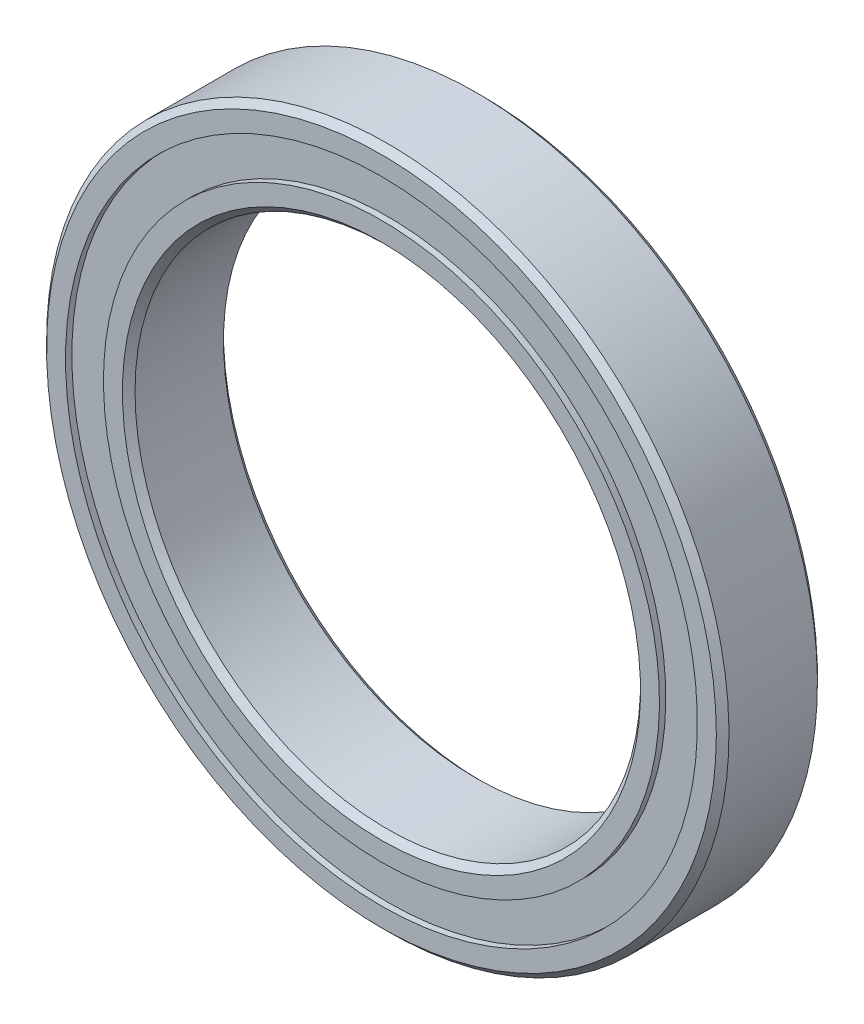
ISO-10303-21;
HEADER;
FILE_DESCRIPTION(('STEP AP214'),'2;1');
FILE_NAME('part.step','',(''),(''),'','','');
FILE_SCHEMA(('AUTOMOTIVE_DESIGN { 1 0 10303 214 1 1 1 1 }'));
ENDSEC;
DATA;
#1=APPLICATION_CONTEXT('core data for automotive mechanical design processes');
#2=APPLICATION_PROTOCOL_DEFINITION('international standard','automotive_design',2000,#1);
#3=PRODUCT_CONTEXT('',#1,'mechanical');
#4=PRODUCT('Part','Part','',(#3));
#5=PRODUCT_RELATED_PRODUCT_CATEGORY('part','',(#4));
#6=PRODUCT_DEFINITION_FORMATION('','',#4);
#7=PRODUCT_DEFINITION_CONTEXT('part definition',#1,'design');
#8=PRODUCT_DEFINITION('design','',#6,#7);
#9=PRODUCT_DEFINITION_SHAPE('','',#8);
#10=(LENGTH_UNIT() NAMED_UNIT(*) SI_UNIT(.MILLI.,.METRE.));
#11=(NAMED_UNIT(*) PLANE_ANGLE_UNIT() SI_UNIT($,.RADIAN.));
#12=(NAMED_UNIT(*) SI_UNIT($,.STERADIAN.) SOLID_ANGLE_UNIT());
#13=UNCERTAINTY_MEASURE_WITH_UNIT(LENGTH_MEASURE(1.E-05),#10,'distance_accuracy_value','');
#14=(GEOMETRIC_REPRESENTATION_CONTEXT(3) GLOBAL_UNCERTAINTY_ASSIGNED_CONTEXT((#13)) GLOBAL_UNIT_ASSIGNED_CONTEXT((#10,
#11,#12)) REPRESENTATION_CONTEXT('',''));
#15=CARTESIAN_POINT('',(0.,0.,0.));
#16=DIRECTION('',(0.,0.,1.));
#17=DIRECTION('',(1.,0.,0.));
#18=AXIS2_PLACEMENT_3D('',#15,#16,#17);
#19=CARTESIAN_POINT('',(0.,0.,5.));
#20=DIRECTION('',(0.,0.,-1.));
#21=DIRECTION('',(-0.117109143745426,0.993119050492545,0.));
#22=AXIS2_PLACEMENT_3D('',#19,#20,#21);
#23=CYLINDRICAL_SURFACE('',#22,13.5);
#24=CARTESIAN_POINT('',(0.,0.,4.75));
#25=DIRECTION('',(0.,0.,-1.));
#26=DIRECTION('',(-0.117109143745426,0.993119050492545,0.));
#27=AXIS2_PLACEMENT_3D('',#24,#25,#26);
#28=CIRCLE('',#27,13.5);
#29=CARTESIAN_POINT('',(-1.58097344056327,13.4071071816495,4.75));
#30=VERTEX_POINT('',#29);
#31=EDGE_CURVE('E27',#30,#30,#28,.T.);
#32=ORIENTED_EDGE('',*,*,#31,.T.);
#33=EDGE_LOOP('',(#32));
#34=FACE_BOUND('',#33,.T.);
#35=CARTESIAN_POINT('',(0.,0.,1.25));
#36=DIRECTION('',(0.,0.,1.));
#37=DIRECTION('',(-0.117109143745426,0.993119050492545,0.));
#38=AXIS2_PLACEMENT_3D('',#35,#36,#37);
#39=CIRCLE('',#38,13.5);
#40=CARTESIAN_POINT('',(-1.58097344056327,13.4071071816495,1.25));
#41=VERTEX_POINT('',#40);
#42=EDGE_CURVE('E11',#41,#41,#39,.T.);
#43=ORIENTED_EDGE('',*,*,#42,.T.);
#44=EDGE_LOOP('',(#43));
#45=FACE_BOUND('',#44,.T.);
#46=ADVANCED_FACE('F17',(#34,#45),#23,.T.);
#47=CARTESIAN_POINT('',(0.,0.,1.24999999999993));
#48=DIRECTION('',(0.,0.,1.));
#49=DIRECTION('',(0.117109143745426,-0.993119050492545,0.));
#50=AXIS2_PLACEMENT_3D('',#47,#48,#49);
#51=CONICAL_SURFACE('',#50,13.5,0.78539816339745);
#52=CARTESIAN_POINT('',(0.,0.,0.999999999999963));
#53=DIRECTION('',(0.,0.,1.));
#54=DIRECTION('',(0.117109143745426,-0.993119050492545,0.));
#55=AXIS2_PLACEMENT_3D('',#52,#53,#54);
#56=CIRCLE('',#55,13.25);
#57=CARTESIAN_POINT('',(1.5516961546269,-13.1588274190262,0.999999999999963));
#58=VERTEX_POINT('',#57);
#59=EDGE_CURVE('E127',#58,#58,#56,.T.);
#60=ORIENTED_EDGE('',*,*,#59,.T.);
#61=EDGE_LOOP('',(#60));
#62=FACE_BOUND('',#61,.T.);
#63=ORIENTED_EDGE('',*,*,#42,.F.);
#64=EDGE_LOOP('',(#63));
#65=FACE_BOUND('',#64,.T.);
#66=ADVANCED_FACE('F193',(#62,#65),#51,.T.);
#67=CARTESIAN_POINT('',(0.,0.,4.75000000000007));
#68=DIRECTION('',(0.,0.,-1.));
#69=DIRECTION('',(-0.117109143745426,0.993119050492545,0.));
#70=AXIS2_PLACEMENT_3D('',#67,#68,#69);
#71=CONICAL_SURFACE('',#70,13.5,0.785398163397435);
#72=CARTESIAN_POINT('',(0.,0.,5.00000000000007));
#73=DIRECTION('',(0.,0.,-1.));
#74=DIRECTION('',(-0.117109143745426,0.993119050492545,0.));
#75=AXIS2_PLACEMENT_3D('',#72,#73,#74);
#76=CIRCLE('',#75,13.25);
#77=CARTESIAN_POINT('',(-1.5516961546269,13.1588274190262,5.00000000000007));
#78=VERTEX_POINT('',#77);
#79=EDGE_CURVE('E128',#78,#78,#76,.T.);
#80=ORIENTED_EDGE('',*,*,#79,.T.);
#81=EDGE_LOOP('',(#80));
#82=FACE_BOUND('',#81,.T.);
#83=ORIENTED_EDGE('',*,*,#31,.F.);
#84=EDGE_LOOP('',(#83));
#85=FACE_BOUND('',#84,.T.);
#86=ADVANCED_FACE('F198',(#82,#85),#71,.T.);
#87=CARTESIAN_POINT('',(0.,0.,1.25));
#88=DIRECTION('',(0.,0.,-1.));
#89=DIRECTION('',(-0.117109143745426,0.993119050492545,0.));
#90=AXIS2_PLACEMENT_3D('',#87,#88,#89);
#91=CYLINDRICAL_SURFACE('',#90,12.5);
#92=CARTESIAN_POINT('',(0.,0.,1.25));
#93=DIRECTION('',(0.,0.,-1.));
#94=DIRECTION('',(-0.117109143745426,0.993119050492545,0.));
#95=AXIS2_PLACEMENT_3D('',#92,#93,#94);
#96=CIRCLE('',#95,12.5);
#97=CARTESIAN_POINT('',(-1.46386429681784,12.4139881311569,1.25));
#98=VERTEX_POINT('',#97);
#99=EDGE_CURVE('E123',#98,#98,#96,.T.);
#100=ORIENTED_EDGE('',*,*,#99,.F.);
#101=EDGE_LOOP('',(#100));
#102=FACE_BOUND('',#101,.T.);
#103=CARTESIAN_POINT('',(0.,0.,1.));
#104=DIRECTION('',(0.,0.,-1.));
#105=DIRECTION('',(-0.117109143745426,0.993119050492545,0.));
#106=AXIS2_PLACEMENT_3D('',#103,#104,#105);
#107=CIRCLE('',#106,12.5);
#108=CARTESIAN_POINT('',(-1.46386429681784,12.4139881311569,1.));
#109=VERTEX_POINT('',#108);
#110=EDGE_CURVE('E133',#109,#109,#107,.T.);
#111=ORIENTED_EDGE('',*,*,#110,.T.);
#112=EDGE_LOOP('',(#111));
#113=FACE_BOUND('',#112,.T.);
#114=ADVANCED_FACE('F19',(#102,#113),#91,.F.);
#115=CARTESIAN_POINT('',(0.,0.,1.25));
#116=DIRECTION('',(0.,0.,-1.));
#117=DIRECTION('',(-0.117109143745426,0.993119050492545,0.));
#118=AXIS2_PLACEMENT_3D('',#115,#116,#117);
#119=CYLINDRICAL_SURFACE('',#118,12.5);
#120=CARTESIAN_POINT('',(0.,0.,4.75));
#121=DIRECTION('',(0.,0.,1.));
#122=DIRECTION('',(0.,-1.,0.));
#123=AXIS2_PLACEMENT_3D('',#120,#121,#122);
#124=CIRCLE('',#123,12.5);
#125=CARTESIAN_POINT('',(0.,-12.5,4.75));
#126=VERTEX_POINT('',#125);
#127=EDGE_CURVE('E112',#126,#126,#124,.T.);
#128=ORIENTED_EDGE('',*,*,#127,.F.);
#129=EDGE_LOOP('',(#128));
#130=FACE_BOUND('',#129,.T.);
#131=CARTESIAN_POINT('',(0.,0.,5.));
#132=DIRECTION('',(0.,0.,-1.));
#133=DIRECTION('',(0.,-1.,0.));
#134=AXIS2_PLACEMENT_3D('',#131,#132,#133);
#135=CIRCLE('',#134,12.5);
#136=CARTESIAN_POINT('',(0.,-12.5,5.));
#137=VERTEX_POINT('',#136);
#138=EDGE_CURVE('E124',#137,#137,#135,.T.);
#139=ORIENTED_EDGE('',*,*,#138,.F.);
#140=EDGE_LOOP('',(#139));
#141=FACE_BOUND('',#140,.T.);
#142=ADVANCED_FACE('F179',(#130,#141),#119,.F.);
#143=CARTESIAN_POINT('',(0.,0.,1.25));
#144=DIRECTION('',(0.,0.,-1.));
#145=DIRECTION('',(-0.117109143745426,0.993119050492545,0.));
#146=AXIS2_PLACEMENT_3D('',#143,#144,#145);
#147=CYLINDRICAL_SURFACE('',#146,11.);
#148=CARTESIAN_POINT('',(0.,0.,1.25));
#149=DIRECTION('',(0.,0.,1.));
#150=DIRECTION('',(-0.117109143745426,0.993119050492545,0.));
#151=AXIS2_PLACEMENT_3D('',#148,#149,#150);
#152=CIRCLE('',#151,11.);
#153=CARTESIAN_POINT('',(-1.28820058119969,10.924309555418,1.25));
#154=VERTEX_POINT('',#153);
#155=EDGE_CURVE('E118',#154,#154,#152,.T.);
#156=ORIENTED_EDGE('',*,*,#155,.F.);
#157=EDGE_LOOP('',(#156));
#158=FACE_BOUND('',#157,.T.);
#159=CARTESIAN_POINT('',(0.,0.,1.));
#160=DIRECTION('',(0.,0.,1.));
#161=DIRECTION('',(-0.117109143745426,0.993119050492545,0.));
#162=AXIS2_PLACEMENT_3D('',#159,#160,#161);
#163=CIRCLE('',#162,11.);
#164=CARTESIAN_POINT('',(-1.28820058119969,10.924309555418,1.));
#165=VERTEX_POINT('',#164);
#166=EDGE_CURVE('E100',#165,#165,#163,.T.);
#167=ORIENTED_EDGE('',*,*,#166,.T.);
#168=EDGE_LOOP('',(#167));
#169=FACE_BOUND('',#168,.T.);
#170=ADVANCED_FACE('F101',(#158,#169),#147,.T.);
#171=CARTESIAN_POINT('',(0.,0.,1.25));
#172=DIRECTION('',(0.,0.,-1.));
#173=DIRECTION('',(-0.117109143745426,0.993119050492545,0.));
#174=AXIS2_PLACEMENT_3D('',#171,#172,#173);
#175=CYLINDRICAL_SURFACE('',#174,11.);
#176=CARTESIAN_POINT('',(0.,0.,4.75));
#177=DIRECTION('',(0.,0.,-1.));
#178=DIRECTION('',(0.,-1.,0.));
#179=AXIS2_PLACEMENT_3D('',#176,#177,#178);
#180=CIRCLE('',#179,11.);
#181=CARTESIAN_POINT('',(0.,-11.,4.75));
#182=VERTEX_POINT('',#181);
#183=EDGE_CURVE('E104',#182,#182,#180,.T.);
#184=ORIENTED_EDGE('',*,*,#183,.F.);
#185=EDGE_LOOP('',(#184));
#186=FACE_BOUND('',#185,.T.);
#187=CARTESIAN_POINT('',(0.,0.,5.));
#188=DIRECTION('',(0.,0.,-1.));
#189=DIRECTION('',(0.,-1.,0.));
#190=AXIS2_PLACEMENT_3D('',#187,#188,#189);
#191=CIRCLE('',#190,11.);
#192=CARTESIAN_POINT('',(0.,-11.,5.));
#193=VERTEX_POINT('',#192);
#194=EDGE_CURVE('E114',#193,#193,#191,.T.);
#195=ORIENTED_EDGE('',*,*,#194,.T.);
#196=EDGE_LOOP('',(#195));
#197=FACE_BOUND('',#196,.T.);
#198=ADVANCED_FACE('F178',(#186,#197),#175,.T.);
#199=CARTESIAN_POINT('',(0.,0.,1.));
#200=DIRECTION('',(0.,0.,-1.));
#201=DIRECTION('',(-0.993119050492545,-0.117109143745426,0.));
#202=AXIS2_PLACEMENT_3D('',#199,#200,#201);
#203=CONICAL_SURFACE('',#202,10.25,0.785398163397442);
#204=CARTESIAN_POINT('',(0.,0.,1.25000000000005));
#205=DIRECTION('',(0.,0.,-1.));
#206=DIRECTION('',(-0.993119050492545,-0.117109143745426,0.));
#207=AXIS2_PLACEMENT_3D('',#204,#205,#206);
#208=CIRCLE('',#207,10.);
#209=CARTESIAN_POINT('',(-9.93119050492544,-1.17109143745426,1.25000000000005));
#210=VERTEX_POINT('',#209);
#211=EDGE_CURVE('E136',#210,#210,#208,.T.);
#212=ORIENTED_EDGE('',*,*,#211,.F.);
#213=EDGE_LOOP('',(#212));
#214=FACE_BOUND('',#213,.T.);
#215=CARTESIAN_POINT('',(0.,0.,1.));
#216=DIRECTION('',(0.,0.,-1.));
#217=DIRECTION('',(-0.993119050492545,-0.117109143745426,0.));
#218=AXIS2_PLACEMENT_3D('',#215,#216,#217);
#219=CIRCLE('',#218,10.25);
#220=CARTESIAN_POINT('',(-10.1794702675486,-1.20036872339062,1.));
#221=VERTEX_POINT('',#220);
#222=EDGE_CURVE('E105',#221,#221,#219,.T.);
#223=ORIENTED_EDGE('',*,*,#222,.T.);
#224=EDGE_LOOP('',(#223));
#225=FACE_BOUND('',#224,.T.);
#226=ADVANCED_FACE('F152',(#214,#225),#203,.F.);
#227=CARTESIAN_POINT('',(0.,0.,5.));
#228=DIRECTION('',(0.,0.,1.));
#229=DIRECTION('',(0.993119050492545,0.117109143745426,0.));
#230=AXIS2_PLACEMENT_3D('',#227,#228,#229);
#231=CONICAL_SURFACE('',#230,10.25,0.785398163397456);
#232=CARTESIAN_POINT('',(0.,0.,4.75));
#233=DIRECTION('',(0.,0.,1.));
#234=DIRECTION('',(0.993119050492545,0.117109143745426,0.));
#235=AXIS2_PLACEMENT_3D('',#232,#233,#234);
#236=CIRCLE('',#235,10.);
#237=CARTESIAN_POINT('',(9.93119050492544,1.17109143745426,4.75));
#238=VERTEX_POINT('',#237);
#239=EDGE_CURVE('E21',#238,#238,#236,.T.);
#240=ORIENTED_EDGE('',*,*,#239,.F.);
#241=EDGE_LOOP('',(#240));
#242=FACE_BOUND('',#241,.T.);
#243=CARTESIAN_POINT('',(0.,0.,5.));
#244=DIRECTION('',(0.,0.,-1.));
#245=DIRECTION('',(0.993119050492545,0.117109143745426,0.));
#246=AXIS2_PLACEMENT_3D('',#243,#244,#245);
#247=CIRCLE('',#246,10.25);
#248=CARTESIAN_POINT('',(10.1794702675486,1.20036872339062,5.));
#249=VERTEX_POINT('',#248);
#250=EDGE_CURVE('E155',#249,#249,#247,.T.);
#251=ORIENTED_EDGE('',*,*,#250,.F.);
#252=EDGE_LOOP('',(#251));
#253=FACE_BOUND('',#252,.T.);
#254=ADVANCED_FACE('F149',(#242,#253),#231,.F.);
#255=CARTESIAN_POINT('',(0.,0.,5.));
#256=DIRECTION('',(0.,0.,-1.));
#257=DIRECTION('',(-0.117109143745426,0.993119050492545,0.));
#258=AXIS2_PLACEMENT_3D('',#255,#256,#257);
#259=CYLINDRICAL_SURFACE('',#258,10.);
#260=ORIENTED_EDGE('',*,*,#239,.T.);
#261=EDGE_LOOP('',(#260));
#262=FACE_BOUND('',#261,.T.);
#263=ORIENTED_EDGE('',*,*,#211,.T.);
#264=EDGE_LOOP('',(#263));
#265=FACE_BOUND('',#264,.T.);
#266=ADVANCED_FACE('F147',(#262,#265),#259,.F.);
#267=CARTESIAN_POINT('',(0.,0.,1.));
#268=DIRECTION('',(0.,0.,1.));
#269=DIRECTION('',(0.,-1.,0.));
#270=AXIS2_PLACEMENT_3D('',#267,#268,#269);
#271=PLANE('',#270);
#272=ORIENTED_EDGE('',*,*,#110,.F.);
#273=EDGE_LOOP('',(#272));
#274=FACE_BOUND('',#273,.T.);
#275=ORIENTED_EDGE('',*,*,#59,.F.);
#276=EDGE_LOOP('',(#275));
#277=FACE_BOUND('',#276,.T.);
#278=ADVANCED_FACE('F204',(#274,#277),#271,.F.);
#279=CARTESIAN_POINT('',(0.,0.,5.));
#280=DIRECTION('',(0.,0.,1.));
#281=DIRECTION('',(0.,-1.,0.));
#282=AXIS2_PLACEMENT_3D('',#279,#280,#281);
#283=PLANE('',#282);
#284=ORIENTED_EDGE('',*,*,#138,.T.);
#285=EDGE_LOOP('',(#284));
#286=FACE_BOUND('',#285,.T.);
#287=ORIENTED_EDGE('',*,*,#79,.F.);
#288=EDGE_LOOP('',(#287));
#289=FACE_BOUND('',#288,.T.);
#290=ADVANCED_FACE('F205',(#286,#289),#283,.T.);
#291=CARTESIAN_POINT('',(0.,0.,1.25));
#292=DIRECTION('',(0.,0.,-1.));
#293=DIRECTION('',(-1.,0.,0.));
#294=AXIS2_PLACEMENT_3D('',#291,#292,#293);
#295=PLANE('',#294);
#296=ORIENTED_EDGE('',*,*,#155,.T.);
#297=EDGE_LOOP('',(#296));
#298=FACE_BOUND('',#297,.T.);
#299=ORIENTED_EDGE('',*,*,#99,.T.);
#300=EDGE_LOOP('',(#299));
#301=FACE_BOUND('',#300,.T.);
#302=ADVANCED_FACE('F174',(#298,#301),#295,.T.);
#303=CARTESIAN_POINT('',(0.,0.,4.75));
#304=DIRECTION('',(0.,0.,1.));
#305=DIRECTION('',(0.,-1.,0.));
#306=AXIS2_PLACEMENT_3D('',#303,#304,#305);
#307=PLANE('',#306);
#308=ORIENTED_EDGE('',*,*,#127,.T.);
#309=EDGE_LOOP('',(#308));
#310=FACE_BOUND('',#309,.T.);
#311=ORIENTED_EDGE('',*,*,#183,.T.);
#312=EDGE_LOOP('',(#311));
#313=FACE_BOUND('',#312,.T.);
#314=ADVANCED_FACE('F211',(#310,#313),#307,.T.);
#315=CARTESIAN_POINT('',(0.,0.,1.));
#316=DIRECTION('',(0.,0.,1.));
#317=DIRECTION('',(0.,-1.,0.));
#318=AXIS2_PLACEMENT_3D('',#315,#316,#317);
#319=PLANE('',#318);
#320=ORIENTED_EDGE('',*,*,#166,.F.);
#321=EDGE_LOOP('',(#320));
#322=FACE_BOUND('',#321,.T.);
#323=ORIENTED_EDGE('',*,*,#222,.F.);
#324=EDGE_LOOP('',(#323));
#325=FACE_BOUND('',#324,.T.);
#326=ADVANCED_FACE('F214',(#322,#325),#319,.F.);
#327=CARTESIAN_POINT('',(0.,0.,5.));
#328=DIRECTION('',(0.,0.,1.));
#329=DIRECTION('',(0.,-1.,0.));
#330=AXIS2_PLACEMENT_3D('',#327,#328,#329);
#331=PLANE('',#330);
#332=ORIENTED_EDGE('',*,*,#194,.F.);
#333=EDGE_LOOP('',(#332));
#334=FACE_BOUND('',#333,.T.);
#335=ORIENTED_EDGE('',*,*,#250,.T.);
#336=EDGE_LOOP('',(#335));
#337=FACE_BOUND('',#336,.T.);
#338=ADVANCED_FACE('F219',(#334,#337),#331,.T.);
#339=CLOSED_SHELL('',(#46,#66,#86,#114,#142,#170,#198,#226,#254,#266,#278,#290,#302,#314,#326,#338));
#340=MANIFOLD_SOLID_BREP('B1',#339);
#341=ADVANCED_BREP_SHAPE_REPRESENTATION('',(#18,#340),#14);
#342=SHAPE_DEFINITION_REPRESENTATION(#9,#341);
ENDSEC;
END-ISO-10303-21;
